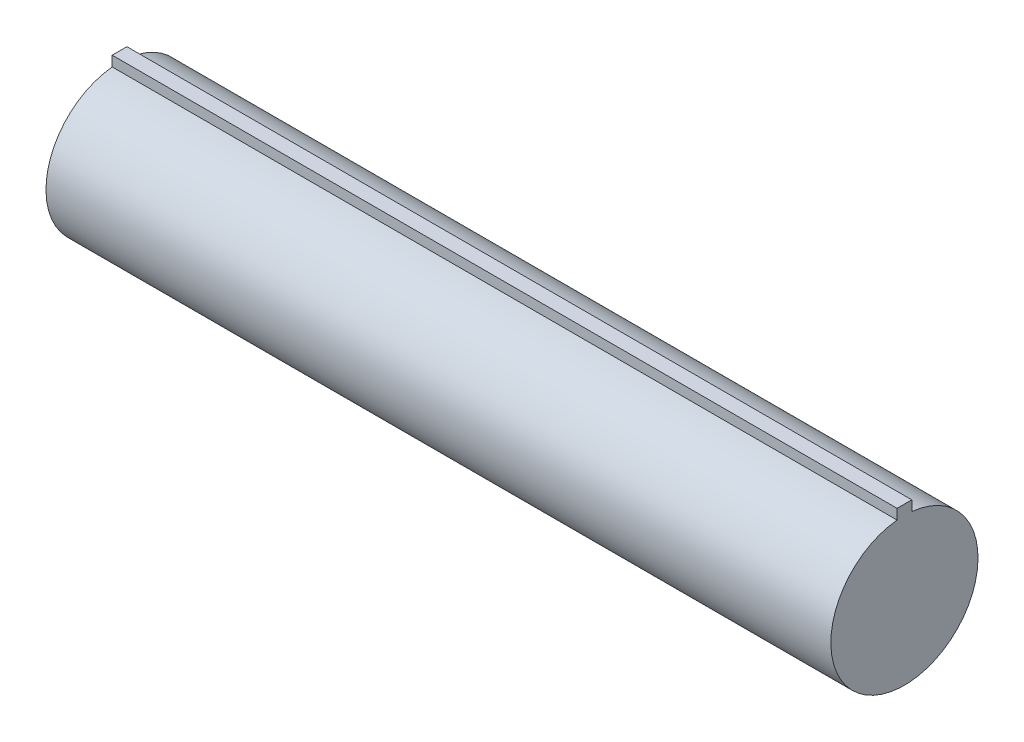
ISO-10303-21;
HEADER;
FILE_DESCRIPTION(('STEP AP214'),'2;1');
FILE_NAME('part.step','',(''),(''),'','','');
FILE_SCHEMA(('AUTOMOTIVE_DESIGN { 1 0 10303 214 1 1 1 1 }'));
ENDSEC;
DATA;
#1=APPLICATION_CONTEXT('core data for automotive mechanical design processes');
#2=APPLICATION_PROTOCOL_DEFINITION('international standard','automotive_design',2000,#1);
#3=PRODUCT_CONTEXT('',#1,'mechanical');
#4=PRODUCT('Part','Part','',(#3));
#5=PRODUCT_RELATED_PRODUCT_CATEGORY('part','',(#4));
#6=PRODUCT_DEFINITION_FORMATION('','',#4);
#7=PRODUCT_DEFINITION_CONTEXT('part definition',#1,'design');
#8=PRODUCT_DEFINITION('design','',#6,#7);
#9=PRODUCT_DEFINITION_SHAPE('','',#8);
#10=(LENGTH_UNIT() NAMED_UNIT(*) SI_UNIT(.MILLI.,.METRE.));
#11=(NAMED_UNIT(*) PLANE_ANGLE_UNIT() SI_UNIT($,.RADIAN.));
#12=(NAMED_UNIT(*) SI_UNIT($,.STERADIAN.) SOLID_ANGLE_UNIT());
#13=UNCERTAINTY_MEASURE_WITH_UNIT(LENGTH_MEASURE(1.E-05),#10,'distance_accuracy_value','');
#14=(GEOMETRIC_REPRESENTATION_CONTEXT(3) GLOBAL_UNCERTAINTY_ASSIGNED_CONTEXT((#13)) GLOBAL_UNIT_ASSIGNED_CONTEXT((#10,
#11,#12)) REPRESENTATION_CONTEXT('',''));
#15=CARTESIAN_POINT('',(0.,0.,0.));
#16=DIRECTION('',(0.,0.,1.));
#17=DIRECTION('',(1.,0.,0.));
#18=AXIS2_PLACEMENT_3D('',#15,#16,#17);
#19=CARTESIAN_POINT('',(80.,0.,0.));
#20=DIRECTION('',(-1.,0.,0.));
#21=DIRECTION('',(0.,0.,1.));
#22=AXIS2_PLACEMENT_3D('',#19,#20,#21);
#23=CYLINDRICAL_SURFACE('',#22,15.);
#24=CARTESIAN_POINT('',(-80.,0.,0.));
#25=DIRECTION('',(1.,0.,0.));
#26=DIRECTION('',(0.,0.,-1.));
#27=AXIS2_PLACEMENT_3D('',#24,#25,#26);
#28=CIRCLE('',#27,15.);
#29=CARTESIAN_POINT('',(-80.,14.9248115565993,1.5));
#30=VERTEX_POINT('',#29);
#31=CARTESIAN_POINT('',(-80.,14.9248115565993,-1.5));
#32=VERTEX_POINT('',#31);
#33=EDGE_CURVE('E106',#30,#32,#28,.T.);
#34=ORIENTED_EDGE('',*,*,#33,.T.);
#35=DIRECTION('',(-1.,0.,0.));
#36=VECTOR('',#35,1.);
#37=CARTESIAN_POINT('',(80.,14.9248115565993,-1.5));
#38=LINE('',#37,#36);
#39=CARTESIAN_POINT('',(80.,14.9248115565993,-1.5));
#40=VERTEX_POINT('',#39);
#41=EDGE_CURVE('E11',#40,#32,#38,.T.);
#42=ORIENTED_EDGE('',*,*,#41,.F.);
#43=CARTESIAN_POINT('',(80.,0.,0.));
#44=DIRECTION('',(1.,0.,0.));
#45=DIRECTION('',(0.,0.,-1.));
#46=AXIS2_PLACEMENT_3D('',#43,#44,#45);
#47=CIRCLE('',#46,15.);
#48=CARTESIAN_POINT('',(80.,14.9248115565993,1.5));
#49=VERTEX_POINT('',#48);
#50=EDGE_CURVE('E92',#49,#40,#47,.T.);
#51=ORIENTED_EDGE('',*,*,#50,.F.);
#52=DIRECTION('',(-1.,0.,0.));
#53=VECTOR('',#52,1.);
#54=CARTESIAN_POINT('',(80.,14.9248115565993,1.5));
#55=LINE('',#54,#53);
#56=EDGE_CURVE('E59',#49,#30,#55,.T.);
#57=ORIENTED_EDGE('',*,*,#56,.T.);
#58=EDGE_LOOP('',(#34,#42,#51,#57));
#59=FACE_BOUND('',#58,.T.);
#60=ADVANCED_FACE('F43',(#59),#23,.T.);
#61=CARTESIAN_POINT('',(80.,0.,-1.5));
#62=DIRECTION('',(0.,0.,1.));
#63=DIRECTION('',(0.,-1.,0.));
#64=AXIS2_PLACEMENT_3D('',#61,#62,#63);
#65=PLANE('',#64);
#66=DIRECTION('',(0.,1.,0.));
#67=VECTOR('',#66,1.);
#68=CARTESIAN_POINT('',(-80.,0.,-1.5));
#69=LINE('',#68,#67);
#70=CARTESIAN_POINT('',(-80.,17.,-1.5));
#71=VERTEX_POINT('',#70);
#72=EDGE_CURVE('E97',#32,#71,#69,.T.);
#73=ORIENTED_EDGE('',*,*,#72,.T.);
#74=DIRECTION('',(-1.,0.,0.));
#75=VECTOR('',#74,1.);
#76=CARTESIAN_POINT('',(80.,17.,-1.5));
#77=LINE('',#76,#75);
#78=CARTESIAN_POINT('',(80.,17.,-1.5));
#79=VERTEX_POINT('',#78);
#80=EDGE_CURVE('E51',#79,#71,#77,.T.);
#81=ORIENTED_EDGE('',*,*,#80,.F.);
#82=DIRECTION('',(0.,1.,0.));
#83=VECTOR('',#82,1.);
#84=CARTESIAN_POINT('',(80.,0.,-1.5));
#85=LINE('',#84,#83);
#86=EDGE_CURVE('E84',#40,#79,#85,.T.);
#87=ORIENTED_EDGE('',*,*,#86,.F.);
#88=ORIENTED_EDGE('',*,*,#41,.T.);
#89=EDGE_LOOP('',(#73,#81,#87,#88));
#90=FACE_BOUND('',#89,.T.);
#91=ADVANCED_FACE('F96',(#90),#65,.F.);
#92=CARTESIAN_POINT('',(80.,17.,0.));
#93=DIRECTION('',(0.,1.,0.));
#94=DIRECTION('',(0.,0.,1.));
#95=AXIS2_PLACEMENT_3D('',#92,#93,#94);
#96=PLANE('',#95);
#97=DIRECTION('',(0.,0.,-1.));
#98=VECTOR('',#97,1.);
#99=CARTESIAN_POINT('',(-80.,17.,0.));
#100=LINE('',#99,#98);
#101=CARTESIAN_POINT('',(-80.,17.,1.5));
#102=VERTEX_POINT('',#101);
#103=EDGE_CURVE('E109',#102,#71,#100,.T.);
#104=ORIENTED_EDGE('',*,*,#103,.F.);
#105=DIRECTION('',(-1.,0.,0.));
#106=VECTOR('',#105,1.);
#107=CARTESIAN_POINT('',(80.,17.,1.5));
#108=LINE('',#107,#106);
#109=CARTESIAN_POINT('',(80.,17.,1.5));
#110=VERTEX_POINT('',#109);
#111=EDGE_CURVE('E73',#110,#102,#108,.T.);
#112=ORIENTED_EDGE('',*,*,#111,.F.);
#113=DIRECTION('',(0.,0.,-1.));
#114=VECTOR('',#113,1.);
#115=CARTESIAN_POINT('',(80.,17.,0.));
#116=LINE('',#115,#114);
#117=EDGE_CURVE('E91',#110,#79,#116,.T.);
#118=ORIENTED_EDGE('',*,*,#117,.T.);
#119=ORIENTED_EDGE('',*,*,#80,.T.);
#120=EDGE_LOOP('',(#104,#112,#118,#119));
#121=FACE_BOUND('',#120,.T.);
#122=ADVANCED_FACE('F100',(#121),#96,.T.);
#123=CARTESIAN_POINT('',(80.,0.,1.5));
#124=DIRECTION('',(0.,0.,1.));
#125=DIRECTION('',(1.,0.,0.));
#126=AXIS2_PLACEMENT_3D('',#123,#124,#125);
#127=PLANE('',#126);
#128=DIRECTION('',(0.,1.,0.));
#129=VECTOR('',#128,1.);
#130=CARTESIAN_POINT('',(-80.,0.,1.5));
#131=LINE('',#130,#129);
#132=EDGE_CURVE('E111',#30,#102,#131,.T.);
#133=ORIENTED_EDGE('',*,*,#132,.F.);
#134=ORIENTED_EDGE('',*,*,#56,.F.);
#135=DIRECTION('',(0.,1.,0.));
#136=VECTOR('',#135,1.);
#137=CARTESIAN_POINT('',(80.,0.,1.5));
#138=LINE('',#137,#136);
#139=EDGE_CURVE('E101',#49,#110,#138,.T.);
#140=ORIENTED_EDGE('',*,*,#139,.T.);
#141=ORIENTED_EDGE('',*,*,#111,.T.);
#142=EDGE_LOOP('',(#133,#134,#140,#141));
#143=FACE_BOUND('',#142,.T.);
#144=ADVANCED_FACE('F117',(#143),#127,.T.);
#145=CARTESIAN_POINT('',(80.,0.,0.));
#146=DIRECTION('',(1.,0.,0.));
#147=DIRECTION('',(0.,0.,-1.));
#148=AXIS2_PLACEMENT_3D('',#145,#146,#147);
#149=PLANE('',#148);
#150=ORIENTED_EDGE('',*,*,#50,.T.);
#151=ORIENTED_EDGE('',*,*,#86,.T.);
#152=ORIENTED_EDGE('',*,*,#117,.F.);
#153=ORIENTED_EDGE('',*,*,#139,.F.);
#154=EDGE_LOOP('',(#150,#151,#152,#153));
#155=FACE_BOUND('',#154,.T.);
#156=ADVANCED_FACE('F88',(#155),#149,.T.);
#157=CARTESIAN_POINT('',(-80.,0.,0.));
#158=DIRECTION('',(1.,0.,0.));
#159=DIRECTION('',(0.,0.,-1.));
#160=AXIS2_PLACEMENT_3D('',#157,#158,#159);
#161=PLANE('',#160);
#162=ORIENTED_EDGE('',*,*,#33,.F.);
#163=ORIENTED_EDGE('',*,*,#132,.T.);
#164=ORIENTED_EDGE('',*,*,#103,.T.);
#165=ORIENTED_EDGE('',*,*,#72,.F.);
#166=EDGE_LOOP('',(#162,#163,#164,#165));
#167=FACE_BOUND('',#166,.T.);
#168=ADVANCED_FACE('F116',(#167),#161,.F.);
#169=CLOSED_SHELL('',(#60,#91,#122,#144,#156,#168));
#170=MANIFOLD_SOLID_BREP('B2',#169);
#171=ADVANCED_BREP_SHAPE_REPRESENTATION('',(#18,#170),#14);
#172=SHAPE_DEFINITION_REPRESENTATION(#9,#171);
ENDSEC;
END-ISO-10303-21;
